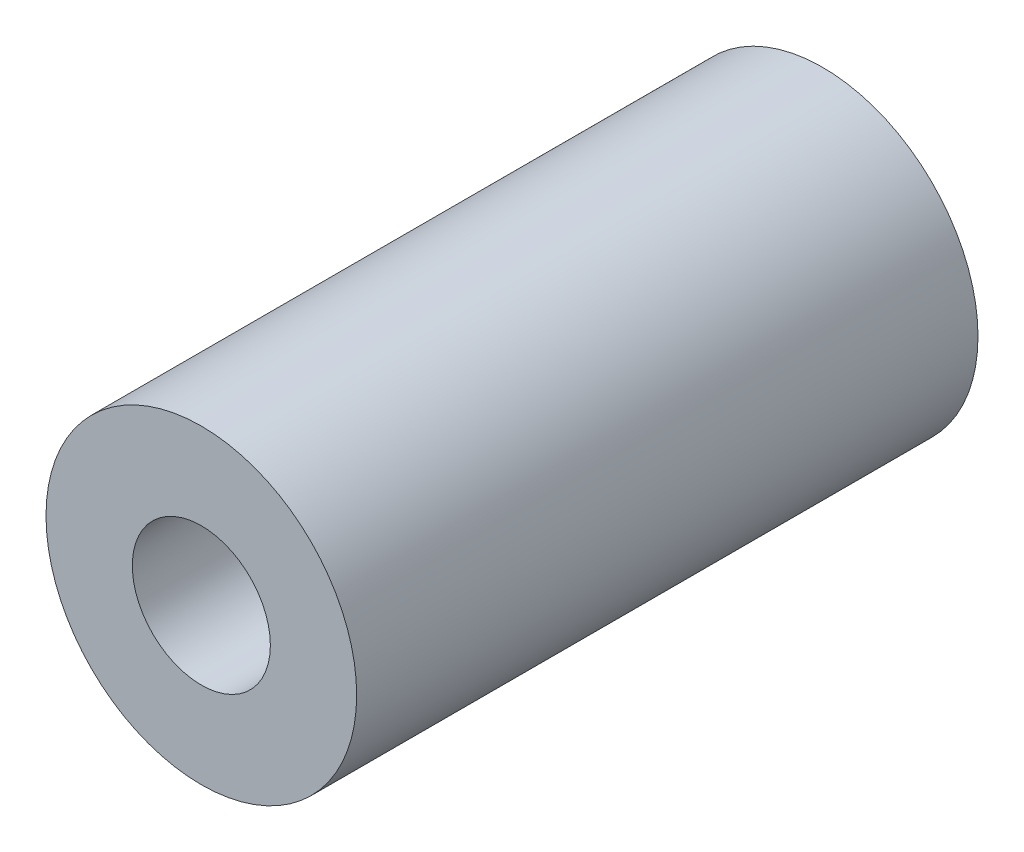
ISO-10303-21;
HEADER;
FILE_DESCRIPTION(('STEP AP214'),'2;1');
FILE_NAME('part.step','',(''),(''),'','','');
FILE_SCHEMA(('AUTOMOTIVE_DESIGN { 1 0 10303 214 1 1 1 1 }'));
ENDSEC;
DATA;
#1=APPLICATION_CONTEXT('core data for automotive mechanical design processes');
#2=APPLICATION_PROTOCOL_DEFINITION('international standard','automotive_design',2000,#1);
#3=PRODUCT_CONTEXT('',#1,'mechanical');
#4=PRODUCT('Part','Part','',(#3));
#5=PRODUCT_RELATED_PRODUCT_CATEGORY('part','',(#4));
#6=PRODUCT_DEFINITION_FORMATION('','',#4);
#7=PRODUCT_DEFINITION_CONTEXT('part definition',#1,'design');
#8=PRODUCT_DEFINITION('design','',#6,#7);
#9=PRODUCT_DEFINITION_SHAPE('','',#8);
#10=(LENGTH_UNIT() NAMED_UNIT(*) SI_UNIT(.MILLI.,.METRE.));
#11=(NAMED_UNIT(*) PLANE_ANGLE_UNIT() SI_UNIT($,.RADIAN.));
#12=(NAMED_UNIT(*) SI_UNIT($,.STERADIAN.) SOLID_ANGLE_UNIT());
#13=UNCERTAINTY_MEASURE_WITH_UNIT(LENGTH_MEASURE(1.E-05),#10,'distance_accuracy_value','');
#14=(GEOMETRIC_REPRESENTATION_CONTEXT(3) GLOBAL_UNCERTAINTY_ASSIGNED_CONTEXT((#13)) GLOBAL_UNIT_ASSIGNED_CONTEXT((#10,
#11,#12)) REPRESENTATION_CONTEXT('',''));
#15=CARTESIAN_POINT('',(0.,0.,0.));
#16=DIRECTION('',(0.,0.,1.));
#17=DIRECTION('',(1.,0.,0.));
#18=AXIS2_PLACEMENT_3D('',#15,#16,#17);
#19=CARTESIAN_POINT('',(0.,0.,18.));
#20=DIRECTION('',(0.,0.,1.));
#21=DIRECTION('',(1.,0.,0.));
#22=AXIS2_PLACEMENT_3D('',#19,#20,#21);
#23=PLANE('',#22);
#24=CARTESIAN_POINT('',(0.,0.,18.));
#25=DIRECTION('',(0.,0.,1.));
#26=DIRECTION('',(1.,0.,0.));
#27=AXIS2_PLACEMENT_3D('',#24,#25,#26);
#28=CIRCLE('',#27,4.);
#29=CARTESIAN_POINT('',(4.,0.,18.));
#30=VERTEX_POINT('',#29);
#31=EDGE_CURVE('E27',#30,#30,#28,.T.);
#32=ORIENTED_EDGE('',*,*,#31,.F.);
#33=EDGE_LOOP('',(#32));
#34=FACE_BOUND('',#33,.T.);
#35=CARTESIAN_POINT('',(0.,0.,18.));
#36=DIRECTION('',(0.,0.,-1.));
#37=DIRECTION('',(-1.,0.,0.));
#38=AXIS2_PLACEMENT_3D('',#35,#36,#37);
#39=CIRCLE('',#38,9.);
#40=CARTESIAN_POINT('',(-9.,0.,18.));
#41=VERTEX_POINT('',#40);
#42=EDGE_CURVE('E9',#41,#41,#39,.T.);
#43=ORIENTED_EDGE('',*,*,#42,.F.);
#44=EDGE_LOOP('',(#43));
#45=FACE_BOUND('',#44,.T.);
#46=ADVANCED_FACE('F14',(#34,#45),#23,.T.);
#47=CARTESIAN_POINT('',(0.,0.,-18.));
#48=DIRECTION('',(0.,0.,-1.));
#49=DIRECTION('',(-1.,0.,0.));
#50=AXIS2_PLACEMENT_3D('',#47,#48,#49);
#51=PLANE('',#50);
#52=CARTESIAN_POINT('',(0.,0.,-18.));
#53=DIRECTION('',(0.,0.,-1.));
#54=DIRECTION('',(-1.,0.,0.));
#55=AXIS2_PLACEMENT_3D('',#52,#53,#54);
#56=CIRCLE('',#55,4.);
#57=CARTESIAN_POINT('',(-4.,0.,-18.));
#58=VERTEX_POINT('',#57);
#59=EDGE_CURVE('E18',#58,#58,#56,.T.);
#60=ORIENTED_EDGE('',*,*,#59,.F.);
#61=EDGE_LOOP('',(#60));
#62=FACE_BOUND('',#61,.T.);
#63=CARTESIAN_POINT('',(0.,0.,-18.));
#64=DIRECTION('',(0.,0.,1.));
#65=DIRECTION('',(1.,0.,0.));
#66=AXIS2_PLACEMENT_3D('',#63,#64,#65);
#67=CIRCLE('',#66,9.);
#68=CARTESIAN_POINT('',(9.,0.,-18.));
#69=VERTEX_POINT('',#68);
#70=EDGE_CURVE('E22',#69,#69,#67,.T.);
#71=ORIENTED_EDGE('',*,*,#70,.F.);
#72=EDGE_LOOP('',(#71));
#73=FACE_BOUND('',#72,.T.);
#74=ADVANCED_FACE('F40',(#62,#73),#51,.T.);
#75=CARTESIAN_POINT('',(0.,0.,-18.));
#76=DIRECTION('',(0.,0.,1.));
#77=DIRECTION('',(1.,0.,0.));
#78=AXIS2_PLACEMENT_3D('',#75,#76,#77);
#79=CYLINDRICAL_SURFACE('',#78,9.);
#80=ORIENTED_EDGE('',*,*,#42,.T.);
#81=EDGE_LOOP('',(#80));
#82=FACE_BOUND('',#81,.T.);
#83=ORIENTED_EDGE('',*,*,#70,.T.);
#84=EDGE_LOOP('',(#83));
#85=FACE_BOUND('',#84,.T.);
#86=ADVANCED_FACE('F16',(#82,#85),#79,.T.);
#87=CARTESIAN_POINT('',(0.,0.,-19.));
#88=DIRECTION('',(0.,0.,1.));
#89=DIRECTION('',(1.,0.,0.));
#90=AXIS2_PLACEMENT_3D('',#87,#88,#89);
#91=CYLINDRICAL_SURFACE('',#90,4.);
#92=ORIENTED_EDGE('',*,*,#31,.T.);
#93=EDGE_LOOP('',(#92));
#94=FACE_BOUND('',#93,.T.);
#95=ORIENTED_EDGE('',*,*,#59,.T.);
#96=EDGE_LOOP('',(#95));
#97=FACE_BOUND('',#96,.T.);
#98=ADVANCED_FACE('F34',(#94,#97),#91,.F.);
#99=CLOSED_SHELL('',(#46,#74,#86,#98));
#100=MANIFOLD_SOLID_BREP('B1',#99);
#101=ADVANCED_BREP_SHAPE_REPRESENTATION('',(#18,#100),#14);
#102=SHAPE_DEFINITION_REPRESENTATION(#9,#101);
ENDSEC;
END-ISO-10303-21;
